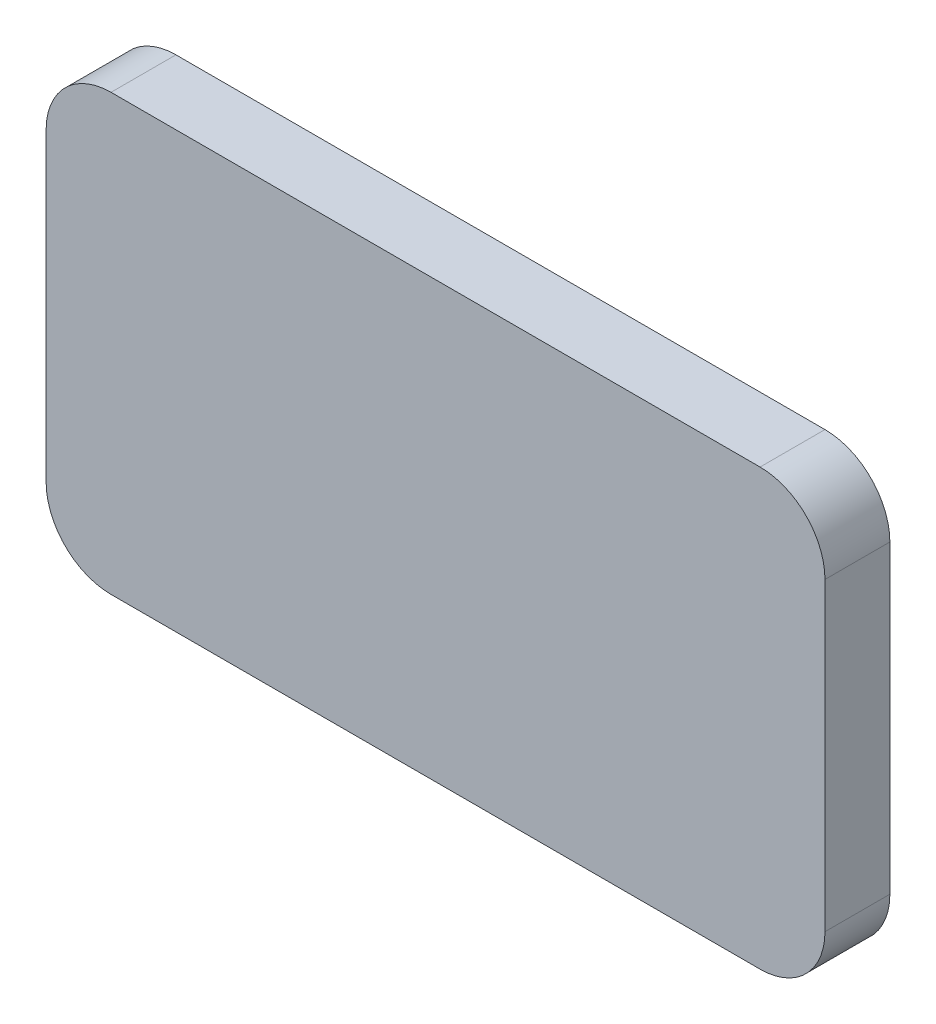
ISO-10303-21;
HEADER;
FILE_DESCRIPTION(('STEP AP214'),'2;1');
FILE_NAME('part.step','',(''),(''),'','','');
FILE_SCHEMA(('AUTOMOTIVE_DESIGN { 1 0 10303 214 1 1 1 1 }'));
ENDSEC;
DATA;
#1=APPLICATION_CONTEXT('core data for automotive mechanical design processes');
#2=APPLICATION_PROTOCOL_DEFINITION('international standard','automotive_design',2000,#1);
#3=PRODUCT_CONTEXT('',#1,'mechanical');
#4=PRODUCT('Part','Part','',(#3));
#5=PRODUCT_RELATED_PRODUCT_CATEGORY('part','',(#4));
#6=PRODUCT_DEFINITION_FORMATION('','',#4);
#7=PRODUCT_DEFINITION_CONTEXT('part definition',#1,'design');
#8=PRODUCT_DEFINITION('design','',#6,#7);
#9=PRODUCT_DEFINITION_SHAPE('','',#8);
#10=(LENGTH_UNIT() NAMED_UNIT(*) SI_UNIT(.MILLI.,.METRE.));
#11=(NAMED_UNIT(*) PLANE_ANGLE_UNIT() SI_UNIT($,.RADIAN.));
#12=(NAMED_UNIT(*) SI_UNIT($,.STERADIAN.) SOLID_ANGLE_UNIT());
#13=UNCERTAINTY_MEASURE_WITH_UNIT(LENGTH_MEASURE(1.E-05),#10,'distance_accuracy_value','');
#14=(GEOMETRIC_REPRESENTATION_CONTEXT(3) GLOBAL_UNCERTAINTY_ASSIGNED_CONTEXT((#13)) GLOBAL_UNIT_ASSIGNED_CONTEXT((#10,
#11,#12)) REPRESENTATION_CONTEXT('',''));
#15=CARTESIAN_POINT('',(0.,0.,0.));
#16=DIRECTION('',(0.,0.,1.));
#17=DIRECTION('',(1.,0.,0.));
#18=AXIS2_PLACEMENT_3D('',#15,#16,#17);
#19=CARTESIAN_POINT('',(21.5,10.9,1.4));
#20=DIRECTION('',(0.,0.,-1.));
#21=DIRECTION('',(-1.,0.,0.));
#22=AXIS2_PLACEMENT_3D('',#19,#20,#21);
#23=PLANE('',#22);
#24=DIRECTION('',(0.,1.,0.));
#25=VECTOR('',#24,1.);
#26=CARTESIAN_POINT('',(2.,2.00000000000001,1.4));
#27=LINE('',#26,#25);
#28=CARTESIAN_POINT('',(2.00000000000001,10.9,1.4));
#29=VERTEX_POINT('',#28);
#30=CARTESIAN_POINT('',(2.,2.5,1.4));
#31=VERTEX_POINT('',#30);
#32=EDGE_CURVE('E217',#29,#31,#27,.F.);
#33=ORIENTED_EDGE('',*,*,#32,.F.);
#34=CARTESIAN_POINT('',(2.50000000000001,10.9,1.4));
#35=DIRECTION('',(0.,0.,1.));
#36=DIRECTION('',(1.,0.,0.));
#37=AXIS2_PLACEMENT_3D('',#34,#35,#36);
#38=CIRCLE('',#37,0.5);
#39=CARTESIAN_POINT('',(2.50000000000001,11.4,1.4));
#40=VERTEX_POINT('',#39);
#41=EDGE_CURVE('E259',#29,#40,#38,.F.);
#42=ORIENTED_EDGE('',*,*,#41,.T.);
#43=DIRECTION('',(1.,0.,0.));
#44=VECTOR('',#43,1.);
#45=CARTESIAN_POINT('',(2.00000000000001,11.4,1.4));
#46=LINE('',#45,#44);
#47=CARTESIAN_POINT('',(10.,11.4,1.4));
#48=VERTEX_POINT('',#47);
#49=EDGE_CURVE('E264',#48,#40,#46,.F.);
#50=ORIENTED_EDGE('',*,*,#49,.F.);
#51=CARTESIAN_POINT('',(10.,10.9,1.4));
#52=DIRECTION('',(0.,0.,1.));
#53=DIRECTION('',(1.,0.,0.));
#54=AXIS2_PLACEMENT_3D('',#51,#52,#53);
#55=CIRCLE('',#54,0.5);
#56=CARTESIAN_POINT('',(10.5,10.9,1.4));
#57=VERTEX_POINT('',#56);
#58=EDGE_CURVE('E268',#48,#57,#55,.F.);
#59=ORIENTED_EDGE('',*,*,#58,.T.);
#60=DIRECTION('',(0.,1.,0.));
#61=VECTOR('',#60,1.);
#62=CARTESIAN_POINT('',(10.5,2.,1.4));
#63=LINE('',#62,#61);
#64=CARTESIAN_POINT('',(10.5,2.5,1.4));
#65=VERTEX_POINT('',#64);
#66=EDGE_CURVE('E272',#57,#65,#63,.F.);
#67=ORIENTED_EDGE('',*,*,#66,.T.);
#68=CARTESIAN_POINT('',(10.,2.5,1.4));
#69=DIRECTION('',(0.,0.,1.));
#70=DIRECTION('',(1.,0.,0.));
#71=AXIS2_PLACEMENT_3D('',#68,#69,#70);
#72=CIRCLE('',#71,0.5);
#73=CARTESIAN_POINT('',(10.,2.,1.4));
#74=VERTEX_POINT('',#73);
#75=EDGE_CURVE('E276',#65,#74,#72,.F.);
#76=ORIENTED_EDGE('',*,*,#75,.T.);
#77=DIRECTION('',(1.,0.,0.));
#78=VECTOR('',#77,1.);
#79=CARTESIAN_POINT('',(2.00000000000001,2.,1.4));
#80=LINE('',#79,#78);
#81=CARTESIAN_POINT('',(2.5,2.,1.4));
#82=VERTEX_POINT('',#81);
#83=EDGE_CURVE('E220',#82,#74,#80,.T.);
#84=ORIENTED_EDGE('',*,*,#83,.F.);
#85=CARTESIAN_POINT('',(2.5,2.5,1.4));
#86=DIRECTION('',(0.,0.,1.));
#87=DIRECTION('',(1.,0.,0.));
#88=AXIS2_PLACEMENT_3D('',#85,#86,#87);
#89=CIRCLE('',#88,0.5);
#90=EDGE_CURVE('E19',#82,#31,#89,.F.);
#91=ORIENTED_EDGE('',*,*,#90,.T.);
#92=EDGE_LOOP('',(#33,#42,#50,#59,#67,#76,#84,#91));
#93=FACE_BOUND('',#92,.T.);
#94=ADVANCED_FACE('F16',(#93),#23,.T.);
#95=CARTESIAN_POINT('',(21.5,10.9,1.4));
#96=DIRECTION('',(0.,0.,-1.));
#97=DIRECTION('',(-1.,0.,0.));
#98=AXIS2_PLACEMENT_3D('',#95,#96,#97);
#99=PLANE('',#98);
#100=DIRECTION('',(0.,-1.,0.));
#101=VECTOR('',#100,1.);
#102=CARTESIAN_POINT('',(22.,2.,1.4));
#103=LINE('',#102,#101);
#104=CARTESIAN_POINT('',(22.,2.5,1.4));
#105=VERTEX_POINT('',#104);
#106=CARTESIAN_POINT('',(22.,10.9,1.4));
#107=VERTEX_POINT('',#106);
#108=EDGE_CURVE('E239',#105,#107,#103,.F.);
#109=ORIENTED_EDGE('',*,*,#108,.F.);
#110=CARTESIAN_POINT('',(21.5,2.5,1.4));
#111=DIRECTION('',(0.,0.,1.));
#112=DIRECTION('',(1.,0.,0.));
#113=AXIS2_PLACEMENT_3D('',#110,#111,#112);
#114=CIRCLE('',#113,0.5);
#115=CARTESIAN_POINT('',(21.5,2.,1.4));
#116=VERTEX_POINT('',#115);
#117=EDGE_CURVE('E223',#105,#116,#114,.F.);
#118=ORIENTED_EDGE('',*,*,#117,.T.);
#119=DIRECTION('',(1.,0.,0.));
#120=VECTOR('',#119,1.);
#121=CARTESIAN_POINT('',(2.00000000000001,2.,1.4));
#122=LINE('',#121,#120);
#123=CARTESIAN_POINT('',(14.,2.,1.4));
#124=VERTEX_POINT('',#123);
#125=EDGE_CURVE('E277',#124,#116,#122,.T.);
#126=ORIENTED_EDGE('',*,*,#125,.F.);
#127=CARTESIAN_POINT('',(14.,2.5,1.4));
#128=DIRECTION('',(0.,0.,1.));
#129=DIRECTION('',(1.,0.,0.));
#130=AXIS2_PLACEMENT_3D('',#127,#128,#129);
#131=CIRCLE('',#130,0.5);
#132=CARTESIAN_POINT('',(13.5,2.5,1.4));
#133=VERTEX_POINT('',#132);
#134=EDGE_CURVE('E287',#124,#133,#131,.F.);
#135=ORIENTED_EDGE('',*,*,#134,.T.);
#136=DIRECTION('',(0.,1.,0.));
#137=VECTOR('',#136,1.);
#138=CARTESIAN_POINT('',(13.5,2.,1.4));
#139=LINE('',#138,#137);
#140=CARTESIAN_POINT('',(13.5,10.9,1.4));
#141=VERTEX_POINT('',#140);
#142=EDGE_CURVE('E283',#133,#141,#139,.T.);
#143=ORIENTED_EDGE('',*,*,#142,.T.);
#144=CARTESIAN_POINT('',(14.,10.9,1.4));
#145=DIRECTION('',(0.,0.,1.));
#146=DIRECTION('',(1.,0.,0.));
#147=AXIS2_PLACEMENT_3D('',#144,#145,#146);
#148=CIRCLE('',#147,0.5);
#149=CARTESIAN_POINT('',(14.,11.4,1.4));
#150=VERTEX_POINT('',#149);
#151=EDGE_CURVE('E374',#141,#150,#148,.F.);
#152=ORIENTED_EDGE('',*,*,#151,.T.);
#153=DIRECTION('',(1.,0.,0.));
#154=VECTOR('',#153,1.);
#155=CARTESIAN_POINT('',(2.00000000000001,11.4,1.4));
#156=LINE('',#155,#154);
#157=CARTESIAN_POINT('',(21.5,11.4,1.4));
#158=VERTEX_POINT('',#157);
#159=EDGE_CURVE('E289',#158,#150,#156,.F.);
#160=ORIENTED_EDGE('',*,*,#159,.F.);
#161=CARTESIAN_POINT('',(21.5,10.9,1.4));
#162=DIRECTION('',(0.,0.,1.));
#163=DIRECTION('',(1.,0.,0.));
#164=AXIS2_PLACEMENT_3D('',#161,#162,#163);
#165=CIRCLE('',#164,0.5);
#166=EDGE_CURVE('E247',#158,#107,#165,.F.);
#167=ORIENTED_EDGE('',*,*,#166,.T.);
#168=EDGE_LOOP('',(#109,#118,#126,#135,#143,#152,#160,#167));
#169=FACE_BOUND('',#168,.T.);
#170=ADVANCED_FACE('F389',(#169),#99,.T.);
#171=CARTESIAN_POINT('',(2.00000000000001,2.,1.5));
#172=DIRECTION('',(0.,1.,0.));
#173=DIRECTION('',(0.,0.,1.));
#174=AXIS2_PLACEMENT_3D('',#171,#172,#173);
#175=PLANE('',#174);
#176=DIRECTION('',(-1.,0.,0.));
#177=VECTOR('',#176,1.);
#178=CARTESIAN_POINT('',(22.,2.,0.));
#179=LINE('',#178,#177);
#180=CARTESIAN_POINT('',(2.5,2.,0.));
#181=VERTEX_POINT('',#180);
#182=CARTESIAN_POINT('',(10.,2.,0.));
#183=VERTEX_POINT('',#182);
#184=EDGE_CURVE('E370',#181,#183,#179,.F.);
#185=ORIENTED_EDGE('',*,*,#184,.F.);
#186=DIRECTION('',(0.,0.,1.));
#187=VECTOR('',#186,1.);
#188=CARTESIAN_POINT('',(2.5,2.,1.5));
#189=LINE('',#188,#187);
#190=EDGE_CURVE('E240',#181,#82,#189,.T.);
#191=ORIENTED_EDGE('',*,*,#190,.T.);
#192=ORIENTED_EDGE('',*,*,#83,.T.);
#193=DIRECTION('',(0.,0.,1.));
#194=VECTOR('',#193,1.);
#195=CARTESIAN_POINT('',(10.,2.,-9.86711710683519));
#196=LINE('',#195,#194);
#197=EDGE_CURVE('E273',#74,#183,#196,.F.);
#198=ORIENTED_EDGE('',*,*,#197,.T.);
#199=EDGE_LOOP('',(#185,#191,#192,#198));
#200=FACE_BOUND('',#199,.T.);
#201=ADVANCED_FACE('F729',(#200),#175,.T.);
#202=CARTESIAN_POINT('',(10.,2.5,-9.86711710683519));
#203=DIRECTION('',(0.,0.,1.));
#204=DIRECTION('',(1.,0.,0.));
#205=AXIS2_PLACEMENT_3D('',#202,#203,#204);
#206=CYLINDRICAL_SURFACE('',#205,0.5);
#207=ORIENTED_EDGE('',*,*,#197,.F.);
#208=ORIENTED_EDGE('',*,*,#75,.F.);
#209=DIRECTION('',(0.,0.,-1.));
#210=VECTOR('',#209,1.);
#211=CARTESIAN_POINT('',(10.5,2.5,-9.86711710683519));
#212=LINE('',#211,#210);
#213=CARTESIAN_POINT('',(10.5,2.5,0.));
#214=VERTEX_POINT('',#213);
#215=EDGE_CURVE('E269',#65,#214,#212,.T.);
#216=ORIENTED_EDGE('',*,*,#215,.T.);
#217=CARTESIAN_POINT('',(10.,2.5,0.));
#218=DIRECTION('',(0.,0.,1.));
#219=DIRECTION('',(1.,0.,0.));
#220=AXIS2_PLACEMENT_3D('',#217,#218,#219);
#221=CIRCLE('',#220,0.5);
#222=EDGE_CURVE('E366',#183,#214,#221,.T.);
#223=ORIENTED_EDGE('',*,*,#222,.F.);
#224=EDGE_LOOP('',(#207,#208,#216,#223));
#225=FACE_BOUND('',#224,.T.);
#226=ADVANCED_FACE('F720',(#225),#206,.F.);
#227=CARTESIAN_POINT('',(10.5,2.,-9.86711710683519));
#228=DIRECTION('',(1.,0.,0.));
#229=DIRECTION('',(0.,0.,-1.));
#230=AXIS2_PLACEMENT_3D('',#227,#228,#229);
#231=PLANE('',#230);
#232=DIRECTION('',(0.,0.,1.));
#233=VECTOR('',#232,1.);
#234=CARTESIAN_POINT('',(10.5,10.9,1.5));
#235=LINE('',#234,#233);
#236=CARTESIAN_POINT('',(10.5,10.9,0.));
#237=VERTEX_POINT('',#236);
#238=EDGE_CURVE('E265',#57,#237,#235,.F.);
#239=ORIENTED_EDGE('',*,*,#238,.T.);
#240=DIRECTION('',(0.,1.,0.));
#241=VECTOR('',#240,1.);
#242=CARTESIAN_POINT('',(10.5,11.4,0.));
#243=LINE('',#242,#241);
#244=EDGE_CURVE('E365',#214,#237,#243,.T.);
#245=ORIENTED_EDGE('',*,*,#244,.F.);
#246=ORIENTED_EDGE('',*,*,#215,.F.);
#247=ORIENTED_EDGE('',*,*,#66,.F.);
#248=EDGE_LOOP('',(#239,#245,#246,#247));
#249=FACE_BOUND('',#248,.T.);
#250=ADVANCED_FACE('F711',(#249),#231,.F.);
#251=CARTESIAN_POINT('',(10.,10.9,1.5));
#252=DIRECTION('',(0.,0.,1.));
#253=DIRECTION('',(1.,0.,0.));
#254=AXIS2_PLACEMENT_3D('',#251,#252,#253);
#255=CYLINDRICAL_SURFACE('',#254,0.5);
#256=ORIENTED_EDGE('',*,*,#238,.F.);
#257=ORIENTED_EDGE('',*,*,#58,.F.);
#258=DIRECTION('',(0.,0.,1.));
#259=VECTOR('',#258,1.);
#260=CARTESIAN_POINT('',(10.,11.4,1.5));
#261=LINE('',#260,#259);
#262=CARTESIAN_POINT('',(10.,11.4,0.));
#263=VERTEX_POINT('',#262);
#264=EDGE_CURVE('E260',#263,#48,#261,.T.);
#265=ORIENTED_EDGE('',*,*,#264,.F.);
#266=CARTESIAN_POINT('',(10.,10.9,0.));
#267=DIRECTION('',(0.,0.,1.));
#268=DIRECTION('',(1.,0.,0.));
#269=AXIS2_PLACEMENT_3D('',#266,#267,#268);
#270=CIRCLE('',#269,0.5);
#271=EDGE_CURVE('E361',#237,#263,#270,.T.);
#272=ORIENTED_EDGE('',*,*,#271,.F.);
#273=EDGE_LOOP('',(#256,#257,#265,#272));
#274=FACE_BOUND('',#273,.T.);
#275=ADVANCED_FACE('F702',(#274),#255,.F.);
#276=CARTESIAN_POINT('',(2.00000000000001,11.4,1.5));
#277=DIRECTION('',(0.,-1.,0.));
#278=DIRECTION('',(1.,0.,0.));
#279=AXIS2_PLACEMENT_3D('',#276,#277,#278);
#280=PLANE('',#279);
#281=ORIENTED_EDGE('',*,*,#49,.T.);
#282=DIRECTION('',(0.,0.,1.));
#283=VECTOR('',#282,1.);
#284=CARTESIAN_POINT('',(2.50000000000001,11.4,1.5));
#285=LINE('',#284,#283);
#286=CARTESIAN_POINT('',(2.50000000000001,11.4,0.));
#287=VERTEX_POINT('',#286);
#288=EDGE_CURVE('E232',#40,#287,#285,.F.);
#289=ORIENTED_EDGE('',*,*,#288,.T.);
#290=DIRECTION('',(-1.,0.,0.));
#291=VECTOR('',#290,1.);
#292=CARTESIAN_POINT('',(22.,11.4,0.));
#293=LINE('',#292,#291);
#294=EDGE_CURVE('E360',#263,#287,#293,.T.);
#295=ORIENTED_EDGE('',*,*,#294,.F.);
#296=ORIENTED_EDGE('',*,*,#264,.T.);
#297=EDGE_LOOP('',(#281,#289,#295,#296));
#298=FACE_BOUND('',#297,.T.);
#299=ADVANCED_FACE('F693',(#298),#280,.T.);
#300=CARTESIAN_POINT('',(2.50000000000001,10.9,1.5));
#301=DIRECTION('',(0.,0.,1.));
#302=DIRECTION('',(1.,0.,0.));
#303=AXIS2_PLACEMENT_3D('',#300,#301,#302);
#304=CYLINDRICAL_SURFACE('',#303,0.5);
#305=ORIENTED_EDGE('',*,*,#41,.F.);
#306=DIRECTION('',(0.,0.,1.));
#307=VECTOR('',#306,1.);
#308=CARTESIAN_POINT('',(2.00000000000001,10.9,1.5));
#309=LINE('',#308,#307);
#310=CARTESIAN_POINT('',(2.00000000000001,10.9,0.));
#311=VERTEX_POINT('',#310);
#312=EDGE_CURVE('E230',#311,#29,#309,.T.);
#313=ORIENTED_EDGE('',*,*,#312,.F.);
#314=CARTESIAN_POINT('',(2.50000000000001,10.9,0.));
#315=DIRECTION('',(0.,0.,1.));
#316=DIRECTION('',(1.,0.,0.));
#317=AXIS2_PLACEMENT_3D('',#314,#315,#316);
#318=CIRCLE('',#317,0.5);
#319=EDGE_CURVE('E356',#287,#311,#318,.T.);
#320=ORIENTED_EDGE('',*,*,#319,.F.);
#321=ORIENTED_EDGE('',*,*,#288,.F.);
#322=EDGE_LOOP('',(#305,#313,#320,#321));
#323=FACE_BOUND('',#322,.T.);
#324=ADVANCED_FACE('F685',(#323),#304,.F.);
#325=CARTESIAN_POINT('',(2.,2.00000000000001,1.5));
#326=DIRECTION('',(1.,0.,0.));
#327=DIRECTION('',(0.,1.,0.));
#328=AXIS2_PLACEMENT_3D('',#325,#326,#327);
#329=PLANE('',#328);
#330=DIRECTION('',(0.,1.,0.));
#331=VECTOR('',#330,1.);
#332=CARTESIAN_POINT('',(2.00000000000001,11.4,0.));
#333=LINE('',#332,#331);
#334=CARTESIAN_POINT('',(2.00000000000001,2.5,0.));
#335=VERTEX_POINT('',#334);
#336=EDGE_CURVE('E355',#311,#335,#333,.F.);
#337=ORIENTED_EDGE('',*,*,#336,.F.);
#338=ORIENTED_EDGE('',*,*,#312,.T.);
#339=ORIENTED_EDGE('',*,*,#32,.T.);
#340=DIRECTION('',(0.,0.,1.));
#341=VECTOR('',#340,1.);
#342=CARTESIAN_POINT('',(2.,2.5,1.5));
#343=LINE('',#342,#341);
#344=EDGE_CURVE('E228',#31,#335,#343,.F.);
#345=ORIENTED_EDGE('',*,*,#344,.T.);
#346=EDGE_LOOP('',(#337,#338,#339,#345));
#347=FACE_BOUND('',#346,.T.);
#348=ADVANCED_FACE('F227',(#347),#329,.T.);
#349=CARTESIAN_POINT('',(2.5,2.5,1.5));
#350=DIRECTION('',(0.,0.,1.));
#351=DIRECTION('',(1.,0.,0.));
#352=AXIS2_PLACEMENT_3D('',#349,#350,#351);
#353=CYLINDRICAL_SURFACE('',#352,0.5);
#354=ORIENTED_EDGE('',*,*,#90,.F.);
#355=ORIENTED_EDGE('',*,*,#190,.F.);
#356=CARTESIAN_POINT('',(2.5,2.5,0.));
#357=DIRECTION('',(0.,0.,1.));
#358=DIRECTION('',(1.,0.,0.));
#359=AXIS2_PLACEMENT_3D('',#356,#357,#358);
#360=CIRCLE('',#359,0.5);
#361=EDGE_CURVE('E236',#335,#181,#360,.T.);
#362=ORIENTED_EDGE('',*,*,#361,.F.);
#363=ORIENTED_EDGE('',*,*,#344,.F.);
#364=EDGE_LOOP('',(#354,#355,#362,#363));
#365=FACE_BOUND('',#364,.T.);
#366=ADVANCED_FACE('F234',(#365),#353,.F.);
#367=CARTESIAN_POINT('',(22.,2.,1.5));
#368=DIRECTION('',(-1.,0.,0.));
#369=DIRECTION('',(0.,-1.,0.));
#370=AXIS2_PLACEMENT_3D('',#367,#368,#369);
#371=PLANE('',#370);
#372=DIRECTION('',(0.,1.,0.));
#373=VECTOR('',#372,1.);
#374=CARTESIAN_POINT('',(22.,11.4,0.));
#375=LINE('',#374,#373);
#376=CARTESIAN_POINT('',(22.,2.5,0.));
#377=VERTEX_POINT('',#376);
#378=CARTESIAN_POINT('',(22.,10.9,0.));
#379=VERTEX_POINT('',#378);
#380=EDGE_CURVE('E353',#377,#379,#375,.T.);
#381=ORIENTED_EDGE('',*,*,#380,.F.);
#382=DIRECTION('',(0.,0.,1.));
#383=VECTOR('',#382,1.);
#384=CARTESIAN_POINT('',(22.,2.5,1.5));
#385=LINE('',#384,#383);
#386=EDGE_CURVE('E280',#377,#105,#385,.T.);
#387=ORIENTED_EDGE('',*,*,#386,.T.);
#388=ORIENTED_EDGE('',*,*,#108,.T.);
#389=DIRECTION('',(0.,0.,1.));
#390=VECTOR('',#389,1.);
#391=CARTESIAN_POINT('',(22.,10.9,1.5));
#392=LINE('',#391,#390);
#393=EDGE_CURVE('E252',#107,#379,#392,.F.);
#394=ORIENTED_EDGE('',*,*,#393,.T.);
#395=EDGE_LOOP('',(#381,#387,#388,#394));
#396=FACE_BOUND('',#395,.T.);
#397=ADVANCED_FACE('F430',(#396),#371,.T.);
#398=CARTESIAN_POINT('',(21.5,10.9,1.5));
#399=DIRECTION('',(0.,0.,1.));
#400=DIRECTION('',(1.,0.,0.));
#401=AXIS2_PLACEMENT_3D('',#398,#399,#400);
#402=CYLINDRICAL_SURFACE('',#401,0.5);
#403=ORIENTED_EDGE('',*,*,#166,.F.);
#404=DIRECTION('',(0.,0.,1.));
#405=VECTOR('',#404,1.);
#406=CARTESIAN_POINT('',(21.5,11.4,1.5));
#407=LINE('',#406,#405);
#408=CARTESIAN_POINT('',(21.5,11.4,0.));
#409=VERTEX_POINT('',#408);
#410=EDGE_CURVE('E291',#409,#158,#407,.T.);
#411=ORIENTED_EDGE('',*,*,#410,.F.);
#412=CARTESIAN_POINT('',(21.5,10.9,0.));
#413=DIRECTION('',(0.,0.,1.));
#414=DIRECTION('',(1.,0.,0.));
#415=AXIS2_PLACEMENT_3D('',#412,#413,#414);
#416=CIRCLE('',#415,0.5);
#417=EDGE_CURVE('E350',#379,#409,#416,.T.);
#418=ORIENTED_EDGE('',*,*,#417,.F.);
#419=ORIENTED_EDGE('',*,*,#393,.F.);
#420=EDGE_LOOP('',(#403,#411,#418,#419));
#421=FACE_BOUND('',#420,.T.);
#422=ADVANCED_FACE('F426',(#421),#402,.F.);
#423=CARTESIAN_POINT('',(2.00000000000001,11.4,1.5));
#424=DIRECTION('',(0.,-1.,0.));
#425=DIRECTION('',(1.,0.,0.));
#426=AXIS2_PLACEMENT_3D('',#423,#424,#425);
#427=PLANE('',#426);
#428=DIRECTION('',(-1.,0.,0.));
#429=VECTOR('',#428,1.);
#430=CARTESIAN_POINT('',(22.,11.4,0.));
#431=LINE('',#430,#429);
#432=CARTESIAN_POINT('',(14.,11.4,0.));
#433=VERTEX_POINT('',#432);
#434=EDGE_CURVE('E349',#409,#433,#431,.T.);
#435=ORIENTED_EDGE('',*,*,#434,.F.);
#436=ORIENTED_EDGE('',*,*,#410,.T.);
#437=ORIENTED_EDGE('',*,*,#159,.T.);
#438=DIRECTION('',(0.,0.,1.));
#439=VECTOR('',#438,1.);
#440=CARTESIAN_POINT('',(14.,11.4,-9.86711710683519));
#441=LINE('',#440,#439);
#442=EDGE_CURVE('E377',#150,#433,#441,.F.);
#443=ORIENTED_EDGE('',*,*,#442,.T.);
#444=EDGE_LOOP('',(#435,#436,#437,#443));
#445=FACE_BOUND('',#444,.T.);
#446=ADVANCED_FACE('F420',(#445),#427,.T.);
#447=CARTESIAN_POINT('',(14.,10.9,-9.86711710683519));
#448=DIRECTION('',(0.,0.,1.));
#449=DIRECTION('',(1.,0.,0.));
#450=AXIS2_PLACEMENT_3D('',#447,#448,#449);
#451=CYLINDRICAL_SURFACE('',#450,0.5);
#452=ORIENTED_EDGE('',*,*,#442,.F.);
#453=ORIENTED_EDGE('',*,*,#151,.F.);
#454=DIRECTION('',(0.,0.,1.));
#455=VECTOR('',#454,1.);
#456=CARTESIAN_POINT('',(13.5,10.9,-9.86711710683519));
#457=LINE('',#456,#455);
#458=CARTESIAN_POINT('',(13.5,10.9,0.));
#459=VERTEX_POINT('',#458);
#460=EDGE_CURVE('E288',#141,#459,#457,.F.);
#461=ORIENTED_EDGE('',*,*,#460,.T.);
#462=CARTESIAN_POINT('',(14.,10.9,0.));
#463=DIRECTION('',(0.,0.,1.));
#464=DIRECTION('',(1.,0.,0.));
#465=AXIS2_PLACEMENT_3D('',#462,#463,#464);
#466=CIRCLE('',#465,0.5);
#467=EDGE_CURVE('E346',#433,#459,#466,.T.);
#468=ORIENTED_EDGE('',*,*,#467,.F.);
#469=EDGE_LOOP('',(#452,#453,#461,#468));
#470=FACE_BOUND('',#469,.T.);
#471=ADVANCED_FACE('F640',(#470),#451,.F.);
#472=CARTESIAN_POINT('',(13.5,2.,-9.86711710683519));
#473=DIRECTION('',(-1.,0.,0.));
#474=DIRECTION('',(0.,0.,1.));
#475=AXIS2_PLACEMENT_3D('',#472,#473,#474);
#476=PLANE('',#475);
#477=DIRECTION('',(0.,0.,1.));
#478=VECTOR('',#477,1.);
#479=CARTESIAN_POINT('',(13.5,2.5,1.5));
#480=LINE('',#479,#478);
#481=CARTESIAN_POINT('',(13.5,2.5,0.));
#482=VERTEX_POINT('',#481);
#483=EDGE_CURVE('E373',#133,#482,#480,.F.);
#484=ORIENTED_EDGE('',*,*,#483,.T.);
#485=DIRECTION('',(0.,1.,0.));
#486=VECTOR('',#485,1.);
#487=CARTESIAN_POINT('',(13.5,11.4,0.));
#488=LINE('',#487,#486);
#489=EDGE_CURVE('E345',#459,#482,#488,.F.);
#490=ORIENTED_EDGE('',*,*,#489,.F.);
#491=ORIENTED_EDGE('',*,*,#460,.F.);
#492=ORIENTED_EDGE('',*,*,#142,.F.);
#493=EDGE_LOOP('',(#484,#490,#491,#492));
#494=FACE_BOUND('',#493,.T.);
#495=ADVANCED_FACE('F631',(#494),#476,.F.);
#496=CARTESIAN_POINT('',(14.,2.5,1.5));
#497=DIRECTION('',(0.,0.,1.));
#498=DIRECTION('',(1.,0.,0.));
#499=AXIS2_PLACEMENT_3D('',#496,#497,#498);
#500=CYLINDRICAL_SURFACE('',#499,0.5);
#501=ORIENTED_EDGE('',*,*,#483,.F.);
#502=ORIENTED_EDGE('',*,*,#134,.F.);
#503=DIRECTION('',(0.,0.,1.));
#504=VECTOR('',#503,1.);
#505=CARTESIAN_POINT('',(14.,2.,1.5));
#506=LINE('',#505,#504);
#507=CARTESIAN_POINT('',(14.,2.,0.));
#508=VERTEX_POINT('',#507);
#509=EDGE_CURVE('E281',#508,#124,#506,.T.);
#510=ORIENTED_EDGE('',*,*,#509,.F.);
#511=CARTESIAN_POINT('',(14.,2.5,0.));
#512=DIRECTION('',(0.,0.,1.));
#513=DIRECTION('',(1.,0.,0.));
#514=AXIS2_PLACEMENT_3D('',#511,#512,#513);
#515=CIRCLE('',#514,0.5);
#516=EDGE_CURVE('E341',#482,#508,#515,.T.);
#517=ORIENTED_EDGE('',*,*,#516,.F.);
#518=EDGE_LOOP('',(#501,#502,#510,#517));
#519=FACE_BOUND('',#518,.T.);
#520=ADVANCED_FACE('F623',(#519),#500,.F.);
#521=CARTESIAN_POINT('',(2.00000000000001,2.,1.5));
#522=DIRECTION('',(0.,1.,0.));
#523=DIRECTION('',(0.,0.,1.));
#524=AXIS2_PLACEMENT_3D('',#521,#522,#523);
#525=PLANE('',#524);
#526=ORIENTED_EDGE('',*,*,#125,.T.);
#527=DIRECTION('',(0.,0.,1.));
#528=VECTOR('',#527,1.);
#529=CARTESIAN_POINT('',(21.5,2.,1.5));
#530=LINE('',#529,#528);
#531=CARTESIAN_POINT('',(21.5,2.,0.));
#532=VERTEX_POINT('',#531);
#533=EDGE_CURVE('E398',#116,#532,#530,.F.);
#534=ORIENTED_EDGE('',*,*,#533,.T.);
#535=DIRECTION('',(-1.,0.,0.));
#536=VECTOR('',#535,1.);
#537=CARTESIAN_POINT('',(22.,2.,0.));
#538=LINE('',#537,#536);
#539=EDGE_CURVE('E340',#508,#532,#538,.F.);
#540=ORIENTED_EDGE('',*,*,#539,.F.);
#541=ORIENTED_EDGE('',*,*,#509,.T.);
#542=EDGE_LOOP('',(#526,#534,#540,#541));
#543=FACE_BOUND('',#542,.T.);
#544=ADVANCED_FACE('F396',(#543),#525,.T.);
#545=CARTESIAN_POINT('',(21.5,2.5,1.5));
#546=DIRECTION('',(0.,0.,1.));
#547=DIRECTION('',(1.,0.,0.));
#548=AXIS2_PLACEMENT_3D('',#545,#546,#547);
#549=CYLINDRICAL_SURFACE('',#548,0.5);
#550=ORIENTED_EDGE('',*,*,#117,.F.);
#551=ORIENTED_EDGE('',*,*,#386,.F.);
#552=CARTESIAN_POINT('',(21.5,2.5,0.));
#553=DIRECTION('',(0.,0.,1.));
#554=DIRECTION('',(1.,0.,0.));
#555=AXIS2_PLACEMENT_3D('',#552,#553,#554);
#556=CIRCLE('',#555,0.5);
#557=EDGE_CURVE('E336',#532,#377,#556,.T.);
#558=ORIENTED_EDGE('',*,*,#557,.F.);
#559=ORIENTED_EDGE('',*,*,#533,.F.);
#560=EDGE_LOOP('',(#550,#551,#558,#559));
#561=FACE_BOUND('',#560,.T.);
#562=ADVANCED_FACE('F400',(#561),#549,.F.);
#563=CARTESIAN_POINT('',(22.,11.4,0.));
#564=DIRECTION('',(0.,0.,-1.));
#565=DIRECTION('',(-1.,0.,0.));
#566=AXIS2_PLACEMENT_3D('',#563,#564,#565);
#567=PLANE('',#566);
#568=ORIENTED_EDGE('',*,*,#539,.T.);
#569=ORIENTED_EDGE('',*,*,#557,.T.);
#570=ORIENTED_EDGE('',*,*,#380,.T.);
#571=ORIENTED_EDGE('',*,*,#417,.T.);
#572=ORIENTED_EDGE('',*,*,#434,.T.);
#573=ORIENTED_EDGE('',*,*,#467,.T.);
#574=ORIENTED_EDGE('',*,*,#489,.T.);
#575=ORIENTED_EDGE('',*,*,#516,.T.);
#576=EDGE_LOOP('',(#568,#569,#570,#571,#572,#573,#574,#575));
#577=FACE_BOUND('',#576,.T.);
#578=CARTESIAN_POINT('',(2.,11.4,0.));
#579=DIRECTION('',(0.,0.,-1.));
#580=DIRECTION('',(-1.,0.,0.));
#581=AXIS2_PLACEMENT_3D('',#578,#579,#580);
#582=CIRCLE('',#581,2.);
#583=CARTESIAN_POINT('',(2.00000000000001,13.4,0.));
#584=VERTEX_POINT('',#583);
#585=CARTESIAN_POINT('',(0.,11.4,0.));
#586=VERTEX_POINT('',#585);
#587=EDGE_CURVE('E328',#584,#586,#582,.F.);
#588=ORIENTED_EDGE('',*,*,#587,.F.);
#589=DIRECTION('',(1.,0.,0.));
#590=VECTOR('',#589,1.);
#591=CARTESIAN_POINT('',(2.00000000000001,13.4,0.));
#592=LINE('',#591,#590);
#593=CARTESIAN_POINT('',(22.,13.4,0.));
#594=VERTEX_POINT('',#593);
#595=EDGE_CURVE('E332',#584,#594,#592,.T.);
#596=ORIENTED_EDGE('',*,*,#595,.T.);
#597=CARTESIAN_POINT('',(22.,11.4,0.));
#598=DIRECTION('',(0.,0.,-1.));
#599=DIRECTION('',(-1.,0.,0.));
#600=AXIS2_PLACEMENT_3D('',#597,#598,#599);
#601=CIRCLE('',#600,2.);
#602=CARTESIAN_POINT('',(24.,11.4,0.));
#603=VERTEX_POINT('',#602);
#604=EDGE_CURVE('E333',#603,#594,#601,.F.);
#605=ORIENTED_EDGE('',*,*,#604,.F.);
#606=DIRECTION('',(0.,1.,0.));
#607=VECTOR('',#606,1.);
#608=CARTESIAN_POINT('',(24.,2.00000000000001,0.));
#609=LINE('',#608,#607);
#610=CARTESIAN_POINT('',(24.,2.00000000000001,0.));
#611=VERTEX_POINT('',#610);
#612=EDGE_CURVE('E317',#603,#611,#609,.F.);
#613=ORIENTED_EDGE('',*,*,#612,.T.);
#614=CARTESIAN_POINT('',(22.,2.,0.));
#615=DIRECTION('',(0.,0.,-1.));
#616=DIRECTION('',(-1.,0.,0.));
#617=AXIS2_PLACEMENT_3D('',#614,#615,#616);
#618=CIRCLE('',#617,2.);
#619=CARTESIAN_POINT('',(22.,0.,0.));
#620=VERTEX_POINT('',#619);
#621=EDGE_CURVE('E318',#620,#611,#618,.F.);
#622=ORIENTED_EDGE('',*,*,#621,.F.);
#623=DIRECTION('',(1.,0.,0.));
#624=VECTOR('',#623,1.);
#625=CARTESIAN_POINT('',(2.00000000000001,0.,0.));
#626=LINE('',#625,#624);
#627=CARTESIAN_POINT('',(2.00000000000001,0.,0.));
#628=VERTEX_POINT('',#627);
#629=EDGE_CURVE('E322',#620,#628,#626,.F.);
#630=ORIENTED_EDGE('',*,*,#629,.T.);
#631=CARTESIAN_POINT('',(2.,2.,0.));
#632=DIRECTION('',(0.,0.,-1.));
#633=DIRECTION('',(-1.,0.,0.));
#634=AXIS2_PLACEMENT_3D('',#631,#632,#633);
#635=CIRCLE('',#634,2.);
#636=CARTESIAN_POINT('',(0.,2.,0.));
#637=VERTEX_POINT('',#636);
#638=EDGE_CURVE('E323',#637,#628,#635,.F.);
#639=ORIENTED_EDGE('',*,*,#638,.F.);
#640=DIRECTION('',(0.,1.,0.));
#641=VECTOR('',#640,1.);
#642=CARTESIAN_POINT('',(0.,2.00000000000001,0.));
#643=LINE('',#642,#641);
#644=EDGE_CURVE('E327',#637,#586,#643,.T.);
#645=ORIENTED_EDGE('',*,*,#644,.T.);
#646=EDGE_LOOP('',(#588,#596,#605,#613,#622,#630,#639,#645));
#647=FACE_BOUND('',#646,.T.);
#648=ORIENTED_EDGE('',*,*,#336,.T.);
#649=ORIENTED_EDGE('',*,*,#361,.T.);
#650=ORIENTED_EDGE('',*,*,#184,.T.);
#651=ORIENTED_EDGE('',*,*,#222,.T.);
#652=ORIENTED_EDGE('',*,*,#244,.T.);
#653=ORIENTED_EDGE('',*,*,#271,.T.);
#654=ORIENTED_EDGE('',*,*,#294,.T.);
#655=ORIENTED_EDGE('',*,*,#319,.T.);
#656=EDGE_LOOP('',(#648,#649,#650,#651,#652,#653,#654,#655));
#657=FACE_BOUND('',#656,.T.);
#658=ADVANCED_FACE('F432',(#577,#647,#657),#567,.T.);
#659=CARTESIAN_POINT('',(22.,11.4,1.5));
#660=DIRECTION('',(0.,0.,-1.));
#661=DIRECTION('',(-1.,0.,0.));
#662=AXIS2_PLACEMENT_3D('',#659,#660,#661);
#663=CYLINDRICAL_SURFACE('',#662,2.);
#664=CARTESIAN_POINT('',(22.,11.4,2.));
#665=DIRECTION('',(0.,0.,-1.));
#666=DIRECTION('',(-1.,0.,0.));
#667=AXIS2_PLACEMENT_3D('',#664,#665,#666);
#668=CIRCLE('',#667,2.);
#669=CARTESIAN_POINT('',(24.,11.4,2.));
#670=VERTEX_POINT('',#669);
#671=CARTESIAN_POINT('',(22.,13.4,2.));
#672=VERTEX_POINT('',#671);
#673=EDGE_CURVE('E314',#670,#672,#668,.F.);
#674=ORIENTED_EDGE('',*,*,#673,.F.);
#675=DIRECTION('',(0.,0.,1.));
#676=VECTOR('',#675,1.);
#677=CARTESIAN_POINT('',(24.,11.4,1.5));
#678=LINE('',#677,#676);
#679=EDGE_CURVE('E457',#670,#603,#678,.F.);
#680=ORIENTED_EDGE('',*,*,#679,.T.);
#681=ORIENTED_EDGE('',*,*,#604,.T.);
#682=DIRECTION('',(0.,0.,-1.));
#683=VECTOR('',#682,1.);
#684=CARTESIAN_POINT('',(22.,13.4,1.5));
#685=LINE('',#684,#683);
#686=EDGE_CURVE('E335',#594,#672,#685,.F.);
#687=ORIENTED_EDGE('',*,*,#686,.T.);
#688=EDGE_LOOP('',(#674,#680,#681,#687));
#689=FACE_BOUND('',#688,.T.);
#690=ADVANCED_FACE('F528',(#689),#663,.T.);
#691=CARTESIAN_POINT('',(2.00000000000001,13.4,1.5));
#692=DIRECTION('',(0.,-1.,0.));
#693=DIRECTION('',(0.,0.,-1.));
#694=AXIS2_PLACEMENT_3D('',#691,#692,#693);
#695=PLANE('',#694);
#696=DIRECTION('',(0.,0.,-1.));
#697=VECTOR('',#696,1.);
#698=CARTESIAN_POINT('',(2.00000000000001,13.4,1.5));
#699=LINE('',#698,#697);
#700=CARTESIAN_POINT('',(2.00000000000001,13.4,2.));
#701=VERTEX_POINT('',#700);
#702=EDGE_CURVE('E331',#701,#584,#699,.T.);
#703=ORIENTED_EDGE('',*,*,#702,.F.);
#704=DIRECTION('',(1.,0.,0.));
#705=VECTOR('',#704,1.);
#706=CARTESIAN_POINT('',(22.,13.4,2.));
#707=LINE('',#706,#705);
#708=EDGE_CURVE('E313',#672,#701,#707,.F.);
#709=ORIENTED_EDGE('',*,*,#708,.F.);
#710=ORIENTED_EDGE('',*,*,#686,.F.);
#711=ORIENTED_EDGE('',*,*,#595,.F.);
#712=EDGE_LOOP('',(#703,#709,#710,#711));
#713=FACE_BOUND('',#712,.T.);
#714=ADVANCED_FACE('F543',(#713),#695,.F.);
#715=CARTESIAN_POINT('',(2.,11.4,1.5));
#716=DIRECTION('',(0.,0.,-1.));
#717=DIRECTION('',(-1.,0.,0.));
#718=AXIS2_PLACEMENT_3D('',#715,#716,#717);
#719=CYLINDRICAL_SURFACE('',#718,2.);
#720=CARTESIAN_POINT('',(2.,11.4,2.));
#721=DIRECTION('',(0.,0.,-1.));
#722=DIRECTION('',(-1.,0.,0.));
#723=AXIS2_PLACEMENT_3D('',#720,#721,#722);
#724=CIRCLE('',#723,2.);
#725=CARTESIAN_POINT('',(0.,11.4,2.));
#726=VERTEX_POINT('',#725);
#727=EDGE_CURVE('E309',#701,#726,#724,.F.);
#728=ORIENTED_EDGE('',*,*,#727,.F.);
#729=ORIENTED_EDGE('',*,*,#702,.T.);
#730=ORIENTED_EDGE('',*,*,#587,.T.);
#731=DIRECTION('',(0.,0.,-1.));
#732=VECTOR('',#731,1.);
#733=CARTESIAN_POINT('',(0.,11.4,1.5));
#734=LINE('',#733,#732);
#735=EDGE_CURVE('E463',#586,#726,#734,.F.);
#736=ORIENTED_EDGE('',*,*,#735,.T.);
#737=EDGE_LOOP('',(#728,#729,#730,#736));
#738=FACE_BOUND('',#737,.T.);
#739=ADVANCED_FACE('F551',(#738),#719,.T.);
#740=CARTESIAN_POINT('',(0.,2.00000000000001,1.5));
#741=DIRECTION('',(1.,0.,0.));
#742=DIRECTION('',(0.,0.,-1.));
#743=AXIS2_PLACEMENT_3D('',#740,#741,#742);
#744=PLANE('',#743);
#745=DIRECTION('',(0.,0.,-1.));
#746=VECTOR('',#745,1.);
#747=CARTESIAN_POINT('',(0.,2.,1.5));
#748=LINE('',#747,#746);
#749=CARTESIAN_POINT('',(0.,2.,2.));
#750=VERTEX_POINT('',#749);
#751=EDGE_CURVE('E326',#750,#637,#748,.T.);
#752=ORIENTED_EDGE('',*,*,#751,.F.);
#753=DIRECTION('',(0.,1.,0.));
#754=VECTOR('',#753,1.);
#755=CARTESIAN_POINT('',(0.,11.4,2.));
#756=LINE('',#755,#754);
#757=EDGE_CURVE('E308',#726,#750,#756,.F.);
#758=ORIENTED_EDGE('',*,*,#757,.F.);
#759=ORIENTED_EDGE('',*,*,#735,.F.);
#760=ORIENTED_EDGE('',*,*,#644,.F.);
#761=EDGE_LOOP('',(#752,#758,#759,#760));
#762=FACE_BOUND('',#761,.T.);
#763=ADVANCED_FACE('F559',(#762),#744,.F.);
#764=CARTESIAN_POINT('',(2.,2.,1.5));
#765=DIRECTION('',(0.,0.,-1.));
#766=DIRECTION('',(-1.,0.,0.));
#767=AXIS2_PLACEMENT_3D('',#764,#765,#766);
#768=CYLINDRICAL_SURFACE('',#767,2.);
#769=CARTESIAN_POINT('',(2.,2.,2.));
#770=DIRECTION('',(0.,0.,-1.));
#771=DIRECTION('',(-1.,0.,0.));
#772=AXIS2_PLACEMENT_3D('',#769,#770,#771);
#773=CIRCLE('',#772,2.);
#774=CARTESIAN_POINT('',(2.00000000000001,0.,2.));
#775=VERTEX_POINT('',#774);
#776=EDGE_CURVE('E304',#750,#775,#773,.F.);
#777=ORIENTED_EDGE('',*,*,#776,.F.);
#778=ORIENTED_EDGE('',*,*,#751,.T.);
#779=ORIENTED_EDGE('',*,*,#638,.T.);
#780=DIRECTION('',(0.,0.,1.));
#781=VECTOR('',#780,1.);
#782=CARTESIAN_POINT('',(2.00000000000001,0.,1.5));
#783=LINE('',#782,#781);
#784=EDGE_CURVE('E460',#628,#775,#783,.T.);
#785=ORIENTED_EDGE('',*,*,#784,.T.);
#786=EDGE_LOOP('',(#777,#778,#779,#785));
#787=FACE_BOUND('',#786,.T.);
#788=ADVANCED_FACE('F514',(#787),#768,.T.);
#789=CARTESIAN_POINT('',(2.00000000000001,0.,1.5));
#790=DIRECTION('',(0.,1.,0.));
#791=DIRECTION('',(0.,0.,1.));
#792=AXIS2_PLACEMENT_3D('',#789,#790,#791);
#793=PLANE('',#792);
#794=DIRECTION('',(0.,0.,-1.));
#795=VECTOR('',#794,1.);
#796=CARTESIAN_POINT('',(22.,0.,1.5));
#797=LINE('',#796,#795);
#798=CARTESIAN_POINT('',(22.,0.,2.));
#799=VERTEX_POINT('',#798);
#800=EDGE_CURVE('E321',#799,#620,#797,.T.);
#801=ORIENTED_EDGE('',*,*,#800,.F.);
#802=DIRECTION('',(1.,0.,0.));
#803=VECTOR('',#802,1.);
#804=CARTESIAN_POINT('',(22.,0.,2.));
#805=LINE('',#804,#803);
#806=EDGE_CURVE('E303',#775,#799,#805,.T.);
#807=ORIENTED_EDGE('',*,*,#806,.F.);
#808=ORIENTED_EDGE('',*,*,#784,.F.);
#809=ORIENTED_EDGE('',*,*,#629,.F.);
#810=EDGE_LOOP('',(#801,#807,#808,#809));
#811=FACE_BOUND('',#810,.T.);
#812=ADVANCED_FACE('F501',(#811),#793,.F.);
#813=CARTESIAN_POINT('',(22.,2.,1.5));
#814=DIRECTION('',(0.,0.,-1.));
#815=DIRECTION('',(-1.,0.,0.));
#816=AXIS2_PLACEMENT_3D('',#813,#814,#815);
#817=CYLINDRICAL_SURFACE('',#816,2.);
#818=CARTESIAN_POINT('',(22.,2.,2.));
#819=DIRECTION('',(0.,0.,-1.));
#820=DIRECTION('',(-1.,0.,0.));
#821=AXIS2_PLACEMENT_3D('',#818,#819,#820);
#822=CIRCLE('',#821,2.);
#823=CARTESIAN_POINT('',(24.,2.00000000000001,2.));
#824=VERTEX_POINT('',#823);
#825=EDGE_CURVE('E26',#799,#824,#822,.F.);
#826=ORIENTED_EDGE('',*,*,#825,.F.);
#827=ORIENTED_EDGE('',*,*,#800,.T.);
#828=ORIENTED_EDGE('',*,*,#621,.T.);
#829=DIRECTION('',(0.,0.,1.));
#830=VECTOR('',#829,1.);
#831=CARTESIAN_POINT('',(24.,2.00000000000001,1.5));
#832=LINE('',#831,#830);
#833=EDGE_CURVE('E39',#611,#824,#832,.T.);
#834=ORIENTED_EDGE('',*,*,#833,.T.);
#835=EDGE_LOOP('',(#826,#827,#828,#834));
#836=FACE_BOUND('',#835,.T.);
#837=ADVANCED_FACE('F503',(#836),#817,.T.);
#838=CARTESIAN_POINT('',(24.,2.00000000000001,1.5));
#839=DIRECTION('',(-1.,0.,0.));
#840=DIRECTION('',(0.,0.,1.));
#841=AXIS2_PLACEMENT_3D('',#838,#839,#840);
#842=PLANE('',#841);
#843=ORIENTED_EDGE('',*,*,#679,.F.);
#844=DIRECTION('',(0.,1.,0.));
#845=VECTOR('',#844,1.);
#846=CARTESIAN_POINT('',(24.,11.4,2.));
#847=LINE('',#846,#845);
#848=EDGE_CURVE('E11',#824,#670,#847,.T.);
#849=ORIENTED_EDGE('',*,*,#848,.F.);
#850=ORIENTED_EDGE('',*,*,#833,.F.);
#851=ORIENTED_EDGE('',*,*,#612,.F.);
#852=EDGE_LOOP('',(#843,#849,#850,#851));
#853=FACE_BOUND('',#852,.T.);
#854=ADVANCED_FACE('F505',(#853),#842,.F.);
#855=CARTESIAN_POINT('',(22.,11.4,2.));
#856=DIRECTION('',(0.,0.,1.));
#857=DIRECTION('',(1.,0.,0.));
#858=AXIS2_PLACEMENT_3D('',#855,#856,#857);
#859=PLANE('',#858);
#860=ORIENTED_EDGE('',*,*,#825,.T.);
#861=ORIENTED_EDGE('',*,*,#848,.T.);
#862=ORIENTED_EDGE('',*,*,#673,.T.);
#863=ORIENTED_EDGE('',*,*,#708,.T.);
#864=ORIENTED_EDGE('',*,*,#727,.T.);
#865=ORIENTED_EDGE('',*,*,#757,.T.);
#866=ORIENTED_EDGE('',*,*,#776,.T.);
#867=ORIENTED_EDGE('',*,*,#806,.T.);
#868=EDGE_LOOP('',(#860,#861,#862,#863,#864,#865,#866,#867));
#869=FACE_BOUND('',#868,.T.);
#870=ADVANCED_FACE('F497',(#869),#859,.T.);
#871=CLOSED_SHELL('',(#94,#170,#201,#226,#250,#275,#299,#324,#348,#366,#397,#422,#446,#471,#495,
#520,#544,#562,#658,#690,#714,#739,#763,#788,#812,#837,#854,#870));
#872=MANIFOLD_SOLID_BREP('B1',#871);
#873=ADVANCED_BREP_SHAPE_REPRESENTATION('',(#18,#872),#14);
#874=SHAPE_DEFINITION_REPRESENTATION(#9,#873);
ENDSEC;
END-ISO-10303-21;
